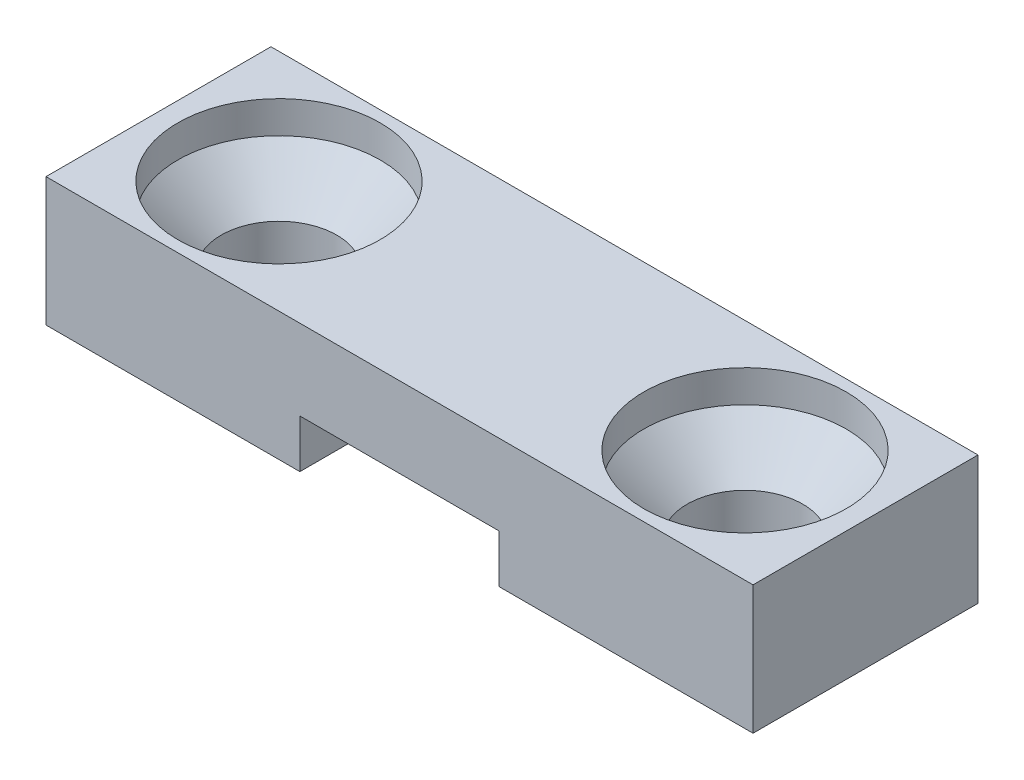
ISO-10303-21;
HEADER;
FILE_DESCRIPTION(('STEP AP214'),'2;1');
FILE_NAME('part.step','',(''),(''),'','','');
FILE_SCHEMA(('AUTOMOTIVE_DESIGN { 1 0 10303 214 1 1 1 1 }'));
ENDSEC;
DATA;
#1=APPLICATION_CONTEXT('core data for automotive mechanical design processes');
#2=APPLICATION_PROTOCOL_DEFINITION('international standard','automotive_design',2000,#1);
#3=PRODUCT_CONTEXT('',#1,'mechanical');
#4=PRODUCT('Part','Part','',(#3));
#5=PRODUCT_RELATED_PRODUCT_CATEGORY('part','',(#4));
#6=PRODUCT_DEFINITION_FORMATION('','',#4);
#7=PRODUCT_DEFINITION_CONTEXT('part definition',#1,'design');
#8=PRODUCT_DEFINITION('design','',#6,#7);
#9=PRODUCT_DEFINITION_SHAPE('','',#8);
#10=(LENGTH_UNIT() NAMED_UNIT(*) SI_UNIT(.MILLI.,.METRE.));
#11=(NAMED_UNIT(*) PLANE_ANGLE_UNIT() SI_UNIT($,.RADIAN.));
#12=(NAMED_UNIT(*) SI_UNIT($,.STERADIAN.) SOLID_ANGLE_UNIT());
#13=UNCERTAINTY_MEASURE_WITH_UNIT(LENGTH_MEASURE(1.E-05),#10,'distance_accuracy_value','');
#14=(GEOMETRIC_REPRESENTATION_CONTEXT(3) GLOBAL_UNCERTAINTY_ASSIGNED_CONTEXT((#13)) GLOBAL_UNIT_ASSIGNED_CONTEXT((#10,
#11,#12)) REPRESENTATION_CONTEXT('',''));
#15=CARTESIAN_POINT('',(0.,0.,0.));
#16=DIRECTION('',(0.,0.,1.));
#17=DIRECTION('',(1.,0.,0.));
#18=AXIS2_PLACEMENT_3D('',#15,#16,#17);
#19=CARTESIAN_POINT('',(-7.25,4.,0.));
#20=DIRECTION('',(0.,1.,0.));
#21=DIRECTION('',(0.,0.,1.));
#22=AXIS2_PLACEMENT_3D('',#19,#20,#21);
#23=CYLINDRICAL_SURFACE('',#22,1.8);
#24=CARTESIAN_POINT('',(-7.25,0.,0.));
#25=DIRECTION('',(0.,1.,0.));
#26=DIRECTION('',(0.,0.,1.));
#27=AXIS2_PLACEMENT_3D('',#24,#25,#26);
#28=CIRCLE('',#27,1.8);
#29=CARTESIAN_POINT('',(-7.25,0.,1.8));
#30=VERTEX_POINT('',#29);
#31=EDGE_CURVE('E19',#30,#30,#28,.F.);
#32=ORIENTED_EDGE('',*,*,#31,.T.);
#33=EDGE_LOOP('',(#32));
#34=FACE_BOUND('',#33,.T.);
#35=CARTESIAN_POINT('',(-7.25,1.64999999998372,0.));
#36=DIRECTION('',(0.,1.,0.));
#37=DIRECTION('',(0.,0.,1.));
#38=AXIS2_PLACEMENT_3D('',#35,#36,#37);
#39=CIRCLE('',#38,1.80000000000291);
#40=CARTESIAN_POINT('',(-7.25,1.64999999998372,1.80000000000291));
#41=VERTEX_POINT('',#40);
#42=EDGE_CURVE('E139',#41,#41,#39,.T.);
#43=ORIENTED_EDGE('',*,*,#42,.T.);
#44=EDGE_LOOP('',(#43));
#45=FACE_BOUND('',#44,.T.);
#46=ADVANCED_FACE('F16',(#34,#45),#23,.F.);
#47=CARTESIAN_POINT('',(7.25,4.,0.));
#48=DIRECTION('',(0.,1.,0.));
#49=DIRECTION('',(0.,0.,1.));
#50=AXIS2_PLACEMENT_3D('',#47,#48,#49);
#51=CYLINDRICAL_SURFACE('',#50,1.8);
#52=CARTESIAN_POINT('',(7.25,0.,0.));
#53=DIRECTION('',(0.,1.,0.));
#54=DIRECTION('',(0.,0.,1.));
#55=AXIS2_PLACEMENT_3D('',#52,#53,#54);
#56=CIRCLE('',#55,1.8);
#57=CARTESIAN_POINT('',(7.25,0.,1.8));
#58=VERTEX_POINT('',#57);
#59=EDGE_CURVE('E124',#58,#58,#56,.F.);
#60=ORIENTED_EDGE('',*,*,#59,.T.);
#61=EDGE_LOOP('',(#60));
#62=FACE_BOUND('',#61,.T.);
#63=CARTESIAN_POINT('',(7.25,1.65000000004056,0.));
#64=DIRECTION('',(0.,1.,0.));
#65=DIRECTION('',(0.,0.,1.));
#66=AXIS2_PLACEMENT_3D('',#63,#64,#65);
#67=CIRCLE('',#66,1.80000000000291);
#68=CARTESIAN_POINT('',(7.25,1.65000000004056,1.80000000000291));
#69=VERTEX_POINT('',#68);
#70=EDGE_CURVE('E132',#69,#69,#67,.T.);
#71=ORIENTED_EDGE('',*,*,#70,.T.);
#72=EDGE_LOOP('',(#71));
#73=FACE_BOUND('',#72,.T.);
#74=ADVANCED_FACE('F154',(#62,#73),#51,.F.);
#75=CARTESIAN_POINT('',(3.1,1.5,-3.5));
#76=DIRECTION('',(1.,0.,0.));
#77=DIRECTION('',(0.,0.,-1.));
#78=AXIS2_PLACEMENT_3D('',#75,#76,#77);
#79=PLANE('',#78);
#80=DIRECTION('',(0.,0.,1.));
#81=VECTOR('',#80,1.);
#82=CARTESIAN_POINT('',(3.1,1.5,-3.5));
#83=LINE('',#82,#81);
#84=CARTESIAN_POINT('',(3.1,1.5,3.5));
#85=VERTEX_POINT('',#84);
#86=CARTESIAN_POINT('',(3.1,1.5,-3.5));
#87=VERTEX_POINT('',#86);
#88=EDGE_CURVE('E120',#85,#87,#83,.F.);
#89=ORIENTED_EDGE('',*,*,#88,.T.);
#90=DIRECTION('',(0.,1.,0.));
#91=VECTOR('',#90,1.);
#92=CARTESIAN_POINT('',(3.1,1.5,-3.5));
#93=LINE('',#92,#91);
#94=CARTESIAN_POINT('',(3.1,0.,-3.5));
#95=VERTEX_POINT('',#94);
#96=EDGE_CURVE('E137',#95,#87,#93,.T.);
#97=ORIENTED_EDGE('',*,*,#96,.F.);
#98=DIRECTION('',(0.,0.,1.));
#99=VECTOR('',#98,1.);
#100=CARTESIAN_POINT('',(3.1,0.,0.));
#101=LINE('',#100,#99);
#102=CARTESIAN_POINT('',(3.1,0.,3.5));
#103=VERTEX_POINT('',#102);
#104=EDGE_CURVE('E102',#95,#103,#101,.T.);
#105=ORIENTED_EDGE('',*,*,#104,.T.);
#106=DIRECTION('',(0.,1.,0.));
#107=VECTOR('',#106,1.);
#108=CARTESIAN_POINT('',(3.1,1.5,3.5));
#109=LINE('',#108,#107);
#110=EDGE_CURVE('E135',#85,#103,#109,.F.);
#111=ORIENTED_EDGE('',*,*,#110,.F.);
#112=EDGE_LOOP('',(#89,#97,#105,#111));
#113=FACE_BOUND('',#112,.T.);
#114=ADVANCED_FACE('F210',(#113),#79,.F.);
#115=CARTESIAN_POINT('',(-3.1,1.5,-3.5));
#116=DIRECTION('',(-1.,0.,0.));
#117=DIRECTION('',(0.,0.,1.));
#118=AXIS2_PLACEMENT_3D('',#115,#116,#117);
#119=PLANE('',#118);
#120=DIRECTION('',(0.,0.,1.));
#121=VECTOR('',#120,1.);
#122=CARTESIAN_POINT('',(-3.1,1.5,-3.5));
#123=LINE('',#122,#121);
#124=CARTESIAN_POINT('',(-3.1,1.5,-3.5));
#125=VERTEX_POINT('',#124);
#126=CARTESIAN_POINT('',(-3.1,1.5,3.5));
#127=VERTEX_POINT('',#126);
#128=EDGE_CURVE('E116',#125,#127,#123,.T.);
#129=ORIENTED_EDGE('',*,*,#128,.T.);
#130=DIRECTION('',(0.,1.,0.));
#131=VECTOR('',#130,1.);
#132=CARTESIAN_POINT('',(-3.1,1.5,3.5));
#133=LINE('',#132,#131);
#134=CARTESIAN_POINT('',(-3.1,0.,3.5));
#135=VERTEX_POINT('',#134);
#136=EDGE_CURVE('E133',#135,#127,#133,.T.);
#137=ORIENTED_EDGE('',*,*,#136,.F.);
#138=DIRECTION('',(0.,0.,1.));
#139=VECTOR('',#138,1.);
#140=CARTESIAN_POINT('',(-3.1,0.,0.));
#141=LINE('',#140,#139);
#142=CARTESIAN_POINT('',(-3.1,0.,-3.5));
#143=VERTEX_POINT('',#142);
#144=EDGE_CURVE('E125',#135,#143,#141,.F.);
#145=ORIENTED_EDGE('',*,*,#144,.T.);
#146=DIRECTION('',(0.,1.,0.));
#147=VECTOR('',#146,1.);
#148=CARTESIAN_POINT('',(-3.1,1.5,-3.5));
#149=LINE('',#148,#147);
#150=EDGE_CURVE('E78',#125,#143,#149,.F.);
#151=ORIENTED_EDGE('',*,*,#150,.F.);
#152=EDGE_LOOP('',(#129,#137,#145,#151));
#153=FACE_BOUND('',#152,.T.);
#154=ADVANCED_FACE('F206',(#153),#119,.F.);
#155=CARTESIAN_POINT('',(7.25,2.9999999999859,0.));
#156=DIRECTION('',(0.,1.,0.));
#157=DIRECTION('',(0.,0.,1.));
#158=AXIS2_PLACEMENT_3D('',#155,#156,#157);
#159=CONICAL_SURFACE('',#158,3.14999999994825,0.785398163397448);
#160=CARTESIAN_POINT('',(7.25,3.,0.));
#161=DIRECTION('',(0.,1.,0.));
#162=DIRECTION('',(0.,0.,1.));
#163=AXIS2_PLACEMENT_3D('',#160,#161,#162);
#164=CIRCLE('',#163,3.15);
#165=CARTESIAN_POINT('',(7.25,3.,3.15));
#166=VERTEX_POINT('',#165);
#167=EDGE_CURVE('E119',#166,#166,#164,.T.);
#168=ORIENTED_EDGE('',*,*,#167,.T.);
#169=EDGE_LOOP('',(#168));
#170=FACE_BOUND('',#169,.T.);
#171=ORIENTED_EDGE('',*,*,#70,.F.);
#172=EDGE_LOOP('',(#171));
#173=FACE_BOUND('',#172,.T.);
#174=ADVANCED_FACE('F203',(#170,#173),#159,.F.);
#175=CARTESIAN_POINT('',(-7.25,3.00000000004275,0.));
#176=DIRECTION('',(0.,1.,0.));
#177=DIRECTION('',(-1.,0.,0.));
#178=AXIS2_PLACEMENT_3D('',#175,#176,#177);
#179=CONICAL_SURFACE('',#178,3.15000000006194,0.785398163397448);
#180=CARTESIAN_POINT('',(-7.25,3.,0.));
#181=DIRECTION('',(0.,1.,0.));
#182=DIRECTION('',(0.,0.,1.));
#183=AXIS2_PLACEMENT_3D('',#180,#181,#182);
#184=CIRCLE('',#183,3.15);
#185=CARTESIAN_POINT('',(-7.25,3.,3.15));
#186=VERTEX_POINT('',#185);
#187=EDGE_CURVE('E94',#186,#186,#184,.T.);
#188=ORIENTED_EDGE('',*,*,#187,.T.);
#189=EDGE_LOOP('',(#188));
#190=FACE_BOUND('',#189,.T.);
#191=ORIENTED_EDGE('',*,*,#42,.F.);
#192=EDGE_LOOP('',(#191));
#193=FACE_BOUND('',#192,.T.);
#194=ADVANCED_FACE('F168',(#190,#193),#179,.F.);
#195=CARTESIAN_POINT('',(0.,0.,0.));
#196=DIRECTION('',(0.,1.,0.));
#197=DIRECTION('',(0.,0.,1.));
#198=AXIS2_PLACEMENT_3D('',#195,#196,#197);
#199=PLANE('',#198);
#200=ORIENTED_EDGE('',*,*,#144,.F.);
#201=DIRECTION('',(-1.,0.,0.));
#202=VECTOR('',#201,1.);
#203=CARTESIAN_POINT('',(-11.,0.,3.5));
#204=LINE('',#203,#202);
#205=CARTESIAN_POINT('',(-11.,0.,3.5));
#206=VERTEX_POINT('',#205);
#207=EDGE_CURVE('E373',#135,#206,#204,.T.);
#208=ORIENTED_EDGE('',*,*,#207,.T.);
#209=DIRECTION('',(0.,0.,-1.));
#210=VECTOR('',#209,1.);
#211=CARTESIAN_POINT('',(-11.,0.,-3.5));
#212=LINE('',#211,#210);
#213=CARTESIAN_POINT('',(-11.,0.,-3.5));
#214=VERTEX_POINT('',#213);
#215=EDGE_CURVE('E375',#206,#214,#212,.T.);
#216=ORIENTED_EDGE('',*,*,#215,.T.);
#217=DIRECTION('',(1.,0.,0.));
#218=VECTOR('',#217,1.);
#219=CARTESIAN_POINT('',(-11.,0.,-3.5));
#220=LINE('',#219,#218);
#221=EDGE_CURVE('E110',#214,#143,#220,.T.);
#222=ORIENTED_EDGE('',*,*,#221,.T.);
#223=EDGE_LOOP('',(#200,#208,#216,#222));
#224=FACE_BOUND('',#223,.T.);
#225=ORIENTED_EDGE('',*,*,#31,.F.);
#226=EDGE_LOOP('',(#225));
#227=FACE_BOUND('',#226,.T.);
#228=ADVANCED_FACE('F158',(#224,#227),#199,.F.);
#229=CARTESIAN_POINT('',(0.,0.,0.));
#230=DIRECTION('',(0.,1.,0.));
#231=DIRECTION('',(0.,0.,1.));
#232=AXIS2_PLACEMENT_3D('',#229,#230,#231);
#233=PLANE('',#232);
#234=ORIENTED_EDGE('',*,*,#104,.F.);
#235=DIRECTION('',(1.,0.,0.));
#236=VECTOR('',#235,1.);
#237=CARTESIAN_POINT('',(-11.,0.,-3.5));
#238=LINE('',#237,#236);
#239=CARTESIAN_POINT('',(11.,0.,-3.5));
#240=VERTEX_POINT('',#239);
#241=EDGE_CURVE('E98',#95,#240,#238,.T.);
#242=ORIENTED_EDGE('',*,*,#241,.T.);
#243=DIRECTION('',(0.,0.,1.));
#244=VECTOR('',#243,1.);
#245=CARTESIAN_POINT('',(11.,0.,-3.5));
#246=LINE('',#245,#244);
#247=CARTESIAN_POINT('',(11.,0.,3.5));
#248=VERTEX_POINT('',#247);
#249=EDGE_CURVE('E83',#240,#248,#246,.T.);
#250=ORIENTED_EDGE('',*,*,#249,.T.);
#251=DIRECTION('',(-1.,0.,0.));
#252=VECTOR('',#251,1.);
#253=CARTESIAN_POINT('',(-11.,0.,3.5));
#254=LINE('',#253,#252);
#255=EDGE_CURVE('E365',#248,#103,#254,.T.);
#256=ORIENTED_EDGE('',*,*,#255,.T.);
#257=EDGE_LOOP('',(#234,#242,#250,#256));
#258=FACE_BOUND('',#257,.T.);
#259=ORIENTED_EDGE('',*,*,#59,.F.);
#260=EDGE_LOOP('',(#259));
#261=FACE_BOUND('',#260,.T.);
#262=ADVANCED_FACE('F99',(#258,#261),#233,.F.);
#263=CARTESIAN_POINT('',(-3.1,1.5,-3.5));
#264=DIRECTION('',(0.,1.,0.));
#265=DIRECTION('',(0.,0.,1.));
#266=AXIS2_PLACEMENT_3D('',#263,#264,#265);
#267=PLANE('',#266);
#268=ORIENTED_EDGE('',*,*,#128,.F.);
#269=DIRECTION('',(1.,0.,0.));
#270=VECTOR('',#269,1.);
#271=CARTESIAN_POINT('',(-11.,1.5,-3.5));
#272=LINE('',#271,#270);
#273=EDGE_CURVE('E104',#125,#87,#272,.T.);
#274=ORIENTED_EDGE('',*,*,#273,.T.);
#275=ORIENTED_EDGE('',*,*,#88,.F.);
#276=DIRECTION('',(-1.,0.,0.));
#277=VECTOR('',#276,1.);
#278=CARTESIAN_POINT('',(-11.,1.5,3.5));
#279=LINE('',#278,#277);
#280=EDGE_CURVE('E150',#85,#127,#279,.T.);
#281=ORIENTED_EDGE('',*,*,#280,.T.);
#282=EDGE_LOOP('',(#268,#274,#275,#281));
#283=FACE_BOUND('',#282,.T.);
#284=ADVANCED_FACE('F157',(#283),#267,.F.);
#285=CARTESIAN_POINT('',(7.25,4.,0.));
#286=DIRECTION('',(0.,1.,0.));
#287=DIRECTION('',(0.,0.,1.));
#288=AXIS2_PLACEMENT_3D('',#285,#286,#287);
#289=CYLINDRICAL_SURFACE('',#288,3.15);
#290=CARTESIAN_POINT('',(7.25,4.,0.));
#291=DIRECTION('',(0.,1.,0.));
#292=DIRECTION('',(0.,0.,1.));
#293=AXIS2_PLACEMENT_3D('',#290,#291,#292);
#294=CIRCLE('',#293,3.15);
#295=CARTESIAN_POINT('',(7.25,4.,3.15));
#296=VERTEX_POINT('',#295);
#297=EDGE_CURVE('E148',#296,#296,#294,.F.);
#298=ORIENTED_EDGE('',*,*,#297,.F.);
#299=EDGE_LOOP('',(#298));
#300=FACE_BOUND('',#299,.T.);
#301=ORIENTED_EDGE('',*,*,#167,.F.);
#302=EDGE_LOOP('',(#301));
#303=FACE_BOUND('',#302,.T.);
#304=ADVANCED_FACE('F165',(#300,#303),#289,.F.);
#305=CARTESIAN_POINT('',(-7.25,4.,0.));
#306=DIRECTION('',(0.,1.,0.));
#307=DIRECTION('',(0.,0.,1.));
#308=AXIS2_PLACEMENT_3D('',#305,#306,#307);
#309=CYLINDRICAL_SURFACE('',#308,3.15);
#310=CARTESIAN_POINT('',(-7.25,4.,0.));
#311=DIRECTION('',(0.,1.,0.));
#312=DIRECTION('',(0.,0.,1.));
#313=AXIS2_PLACEMENT_3D('',#310,#311,#312);
#314=CIRCLE('',#313,3.15);
#315=CARTESIAN_POINT('',(-7.25,4.,3.15));
#316=VERTEX_POINT('',#315);
#317=EDGE_CURVE('E144',#316,#316,#314,.F.);
#318=ORIENTED_EDGE('',*,*,#317,.F.);
#319=EDGE_LOOP('',(#318));
#320=FACE_BOUND('',#319,.T.);
#321=ORIENTED_EDGE('',*,*,#187,.F.);
#322=EDGE_LOOP('',(#321));
#323=FACE_BOUND('',#322,.T.);
#324=ADVANCED_FACE('F191',(#320,#323),#309,.F.);
#325=CARTESIAN_POINT('',(11.,4.,-3.5));
#326=DIRECTION('',(-1.,0.,0.));
#327=DIRECTION('',(0.,0.,1.));
#328=AXIS2_PLACEMENT_3D('',#325,#326,#327);
#329=PLANE('',#328);
#330=DIRECTION('',(0.,1.,0.));
#331=VECTOR('',#330,1.);
#332=CARTESIAN_POINT('',(11.,4.,-3.5));
#333=LINE('',#332,#331);
#334=CARTESIAN_POINT('',(11.,4.,-3.5));
#335=VERTEX_POINT('',#334);
#336=EDGE_CURVE('E87',#240,#335,#333,.T.);
#337=ORIENTED_EDGE('',*,*,#336,.T.);
#338=DIRECTION('',(0.,0.,1.));
#339=VECTOR('',#338,1.);
#340=CARTESIAN_POINT('',(11.,4.,0.));
#341=LINE('',#340,#339);
#342=CARTESIAN_POINT('',(11.,4.,3.5));
#343=VERTEX_POINT('',#342);
#344=EDGE_CURVE('E147',#343,#335,#341,.F.);
#345=ORIENTED_EDGE('',*,*,#344,.F.);
#346=DIRECTION('',(0.,1.,0.));
#347=VECTOR('',#346,1.);
#348=CARTESIAN_POINT('',(11.,4.,3.5));
#349=LINE('',#348,#347);
#350=EDGE_CURVE('E90',#343,#248,#349,.F.);
#351=ORIENTED_EDGE('',*,*,#350,.T.);
#352=ORIENTED_EDGE('',*,*,#249,.F.);
#353=EDGE_LOOP('',(#337,#345,#351,#352));
#354=FACE_BOUND('',#353,.T.);
#355=ADVANCED_FACE('F85',(#354),#329,.F.);
#356=CARTESIAN_POINT('',(-11.,4.,-3.5));
#357=DIRECTION('',(0.,0.,1.));
#358=DIRECTION('',(1.,0.,0.));
#359=AXIS2_PLACEMENT_3D('',#356,#357,#358);
#360=PLANE('',#359);
#361=ORIENTED_EDGE('',*,*,#96,.T.);
#362=ORIENTED_EDGE('',*,*,#273,.F.);
#363=ORIENTED_EDGE('',*,*,#150,.T.);
#364=ORIENTED_EDGE('',*,*,#221,.F.);
#365=DIRECTION('',(0.,1.,0.));
#366=VECTOR('',#365,1.);
#367=CARTESIAN_POINT('',(-11.,4.,-3.5));
#368=LINE('',#367,#366);
#369=CARTESIAN_POINT('',(-11.,4.,-3.5));
#370=VERTEX_POINT('',#369);
#371=EDGE_CURVE('E103',#214,#370,#368,.T.);
#372=ORIENTED_EDGE('',*,*,#371,.T.);
#373=DIRECTION('',(1.,0.,0.));
#374=VECTOR('',#373,1.);
#375=CARTESIAN_POINT('',(0.,4.,-3.5));
#376=LINE('',#375,#374);
#377=EDGE_CURVE('E108',#335,#370,#376,.F.);
#378=ORIENTED_EDGE('',*,*,#377,.F.);
#379=ORIENTED_EDGE('',*,*,#336,.F.);
#380=ORIENTED_EDGE('',*,*,#241,.F.);
#381=EDGE_LOOP('',(#361,#362,#363,#364,#372,#378,#379,#380));
#382=FACE_BOUND('',#381,.T.);
#383=ADVANCED_FACE('F106',(#382),#360,.F.);
#384=CARTESIAN_POINT('',(-11.,4.,-3.5));
#385=DIRECTION('',(1.,0.,0.));
#386=DIRECTION('',(0.,0.,-1.));
#387=AXIS2_PLACEMENT_3D('',#384,#385,#386);
#388=PLANE('',#387);
#389=DIRECTION('',(0.,1.,0.));
#390=VECTOR('',#389,1.);
#391=CARTESIAN_POINT('',(-11.,4.,3.5));
#392=LINE('',#391,#390);
#393=CARTESIAN_POINT('',(-11.,4.,3.5));
#394=VERTEX_POINT('',#393);
#395=EDGE_CURVE('E34',#206,#394,#392,.T.);
#396=ORIENTED_EDGE('',*,*,#395,.T.);
#397=DIRECTION('',(0.,0.,1.));
#398=VECTOR('',#397,1.);
#399=CARTESIAN_POINT('',(-11.,4.,0.));
#400=LINE('',#399,#398);
#401=EDGE_CURVE('E25',#370,#394,#400,.T.);
#402=ORIENTED_EDGE('',*,*,#401,.F.);
#403=ORIENTED_EDGE('',*,*,#371,.F.);
#404=ORIENTED_EDGE('',*,*,#215,.F.);
#405=EDGE_LOOP('',(#396,#402,#403,#404));
#406=FACE_BOUND('',#405,.T.);
#407=ADVANCED_FACE('F179',(#406),#388,.F.);
#408=CARTESIAN_POINT('',(-11.,4.,3.5));
#409=DIRECTION('',(0.,0.,-1.));
#410=DIRECTION('',(-1.,0.,0.));
#411=AXIS2_PLACEMENT_3D('',#408,#409,#410);
#412=PLANE('',#411);
#413=ORIENTED_EDGE('',*,*,#110,.T.);
#414=ORIENTED_EDGE('',*,*,#255,.F.);
#415=ORIENTED_EDGE('',*,*,#350,.F.);
#416=DIRECTION('',(1.,0.,0.));
#417=VECTOR('',#416,1.);
#418=CARTESIAN_POINT('',(0.,4.,3.5));
#419=LINE('',#418,#417);
#420=EDGE_CURVE('E11',#394,#343,#419,.T.);
#421=ORIENTED_EDGE('',*,*,#420,.F.);
#422=ORIENTED_EDGE('',*,*,#395,.F.);
#423=ORIENTED_EDGE('',*,*,#207,.F.);
#424=ORIENTED_EDGE('',*,*,#136,.T.);
#425=ORIENTED_EDGE('',*,*,#280,.F.);
#426=EDGE_LOOP('',(#413,#414,#415,#421,#422,#423,#424,#425));
#427=FACE_BOUND('',#426,.T.);
#428=ADVANCED_FACE('F173',(#427),#412,.F.);
#429=CARTESIAN_POINT('',(0.,4.,0.));
#430=DIRECTION('',(0.,1.,0.));
#431=DIRECTION('',(0.,0.,1.));
#432=AXIS2_PLACEMENT_3D('',#429,#430,#431);
#433=PLANE('',#432);
#434=ORIENTED_EDGE('',*,*,#401,.T.);
#435=ORIENTED_EDGE('',*,*,#420,.T.);
#436=ORIENTED_EDGE('',*,*,#344,.T.);
#437=ORIENTED_EDGE('',*,*,#377,.T.);
#438=EDGE_LOOP('',(#434,#435,#436,#437));
#439=FACE_BOUND('',#438,.T.);
#440=ORIENTED_EDGE('',*,*,#317,.T.);
#441=EDGE_LOOP('',(#440));
#442=FACE_BOUND('',#441,.T.);
#443=ORIENTED_EDGE('',*,*,#297,.T.);
#444=EDGE_LOOP('',(#443));
#445=FACE_BOUND('',#444,.T.);
#446=ADVANCED_FACE('F171',(#439,#442,#445),#433,.T.);
#447=CLOSED_SHELL('',(#46,#74,#114,#154,#174,#194,#228,#262,#284,#304,#324,#355,#383,#407,#428,#446));
#448=MANIFOLD_SOLID_BREP('B1',#447);
#449=ADVANCED_BREP_SHAPE_REPRESENTATION('',(#18,#448),#14);
#450=SHAPE_DEFINITION_REPRESENTATION(#9,#449);
ENDSEC;
END-ISO-10303-21;
